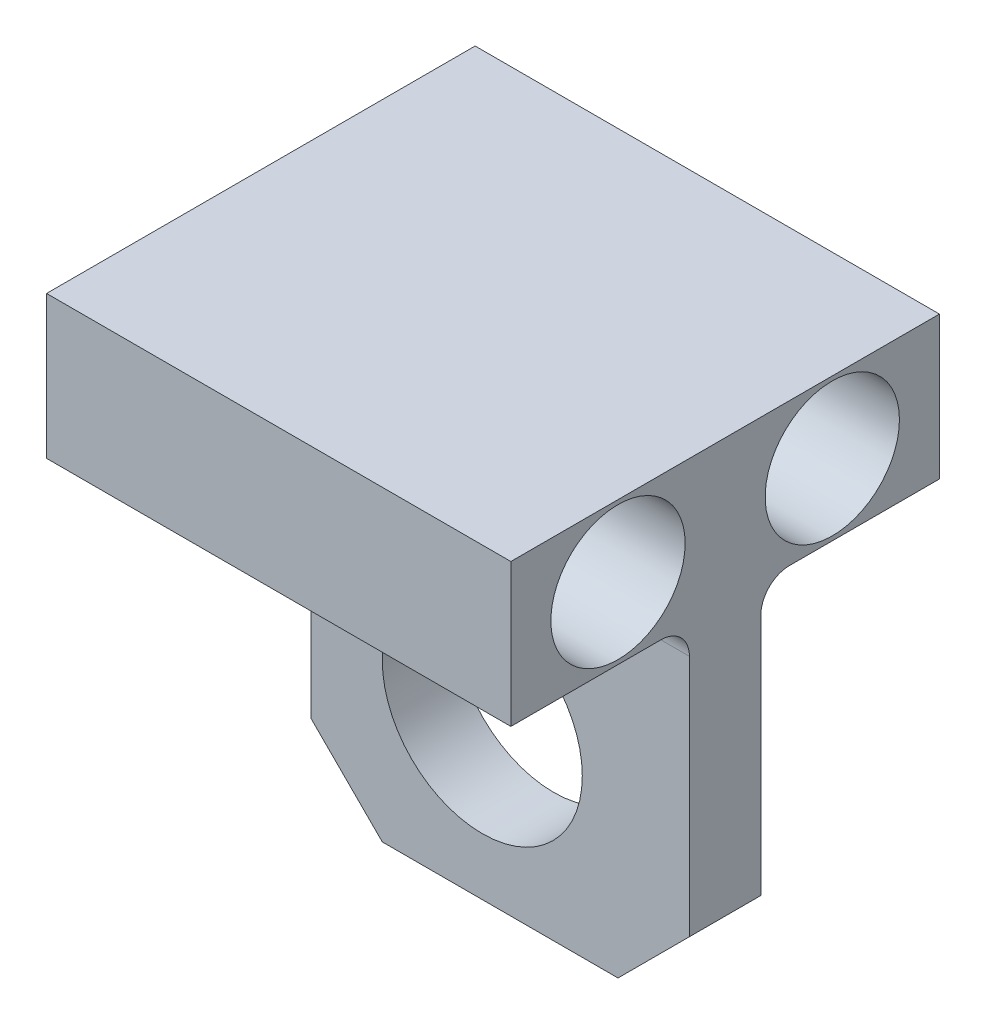
ISO-10303-21;
HEADER;
FILE_DESCRIPTION(('STEP AP214'),'2;1');
FILE_NAME('part.step','',(''),(''),'','','');
FILE_SCHEMA(('AUTOMOTIVE_DESIGN { 1 0 10303 214 1 1 1 1 }'));
ENDSEC;
DATA;
#1=APPLICATION_CONTEXT('core data for automotive mechanical design processes');
#2=APPLICATION_PROTOCOL_DEFINITION('international standard','automotive_design',2000,#1);
#3=PRODUCT_CONTEXT('',#1,'mechanical');
#4=PRODUCT('Part','Part','',(#3));
#5=PRODUCT_RELATED_PRODUCT_CATEGORY('part','',(#4));
#6=PRODUCT_DEFINITION_FORMATION('','',#4);
#7=PRODUCT_DEFINITION_CONTEXT('part definition',#1,'design');
#8=PRODUCT_DEFINITION('design','',#6,#7);
#9=PRODUCT_DEFINITION_SHAPE('','',#8);
#10=(LENGTH_UNIT() NAMED_UNIT(*) SI_UNIT(.MILLI.,.METRE.));
#11=(NAMED_UNIT(*) PLANE_ANGLE_UNIT() SI_UNIT($,.RADIAN.));
#12=(NAMED_UNIT(*) SI_UNIT($,.STERADIAN.) SOLID_ANGLE_UNIT());
#13=UNCERTAINTY_MEASURE_WITH_UNIT(LENGTH_MEASURE(1.E-05),#10,'distance_accuracy_value','');
#14=(GEOMETRIC_REPRESENTATION_CONTEXT(3) GLOBAL_UNCERTAINTY_ASSIGNED_CONTEXT((#13)) GLOBAL_UNIT_ASSIGNED_CONTEXT((#10,
#11,#12)) REPRESENTATION_CONTEXT('',''));
#15=CARTESIAN_POINT('',(0.,0.,0.));
#16=DIRECTION('',(0.,0.,1.));
#17=DIRECTION('',(1.,0.,0.));
#18=AXIS2_PLACEMENT_3D('',#15,#16,#17);
#19=CARTESIAN_POINT('',(16.25,-17.,15.));
#20=DIRECTION('',(0.,1.,0.));
#21=DIRECTION('',(0.,0.,1.));
#22=AXIS2_PLACEMENT_3D('',#19,#20,#21);
#23=PLANE('',#22);
#24=DIRECTION('',(1.,0.,0.));
#25=VECTOR('',#24,1.);
#26=CARTESIAN_POINT('',(-16.25,-17.,2.5));
#27=LINE('',#26,#25);
#28=CARTESIAN_POINT('',(-5.25,-17.,2.5));
#29=VERTEX_POINT('',#28);
#30=CARTESIAN_POINT('',(11.25,-17.,2.5));
#31=VERTEX_POINT('',#30);
#32=EDGE_CURVE('E149',#29,#31,#27,.T.);
#33=ORIENTED_EDGE('',*,*,#32,.F.);
#34=DIRECTION('',(0.,0.,-1.));
#35=VECTOR('',#34,1.);
#36=CARTESIAN_POINT('',(-5.25,-17.,-2.5));
#37=LINE('',#36,#35);
#38=CARTESIAN_POINT('',(-5.25,-17.,-2.5));
#39=VERTEX_POINT('',#38);
#40=EDGE_CURVE('E198',#29,#39,#37,.T.);
#41=ORIENTED_EDGE('',*,*,#40,.T.);
#42=DIRECTION('',(1.,0.,0.));
#43=VECTOR('',#42,1.);
#44=CARTESIAN_POINT('',(-16.25,-17.,-2.5));
#45=LINE('',#44,#43);
#46=CARTESIAN_POINT('',(11.25,-17.,-2.5));
#47=VERTEX_POINT('',#46);
#48=EDGE_CURVE('E222',#39,#47,#45,.T.);
#49=ORIENTED_EDGE('',*,*,#48,.T.);
#50=DIRECTION('',(0.,0.,1.));
#51=VECTOR('',#50,1.);
#52=CARTESIAN_POINT('',(11.25,-17.,15.));
#53=LINE('',#52,#51);
#54=EDGE_CURVE('E196',#47,#31,#53,.T.);
#55=ORIENTED_EDGE('',*,*,#54,.T.);
#56=EDGE_LOOP('',(#33,#41,#49,#55));
#57=FACE_BOUND('',#56,.T.);
#58=ADVANCED_FACE('F35',(#57),#23,.F.);
#59=CARTESIAN_POINT('',(-16.25,0.,0.));
#60=DIRECTION('',(-1.,0.,0.));
#61=DIRECTION('',(0.,0.,1.));
#62=AXIS2_PLACEMENT_3D('',#59,#60,#61);
#63=PLANE('',#62);
#64=CARTESIAN_POINT('',(-16.25,12.,-7.5));
#65=DIRECTION('',(1.,0.,0.));
#66=DIRECTION('',(0.,0.,-1.));
#67=AXIS2_PLACEMENT_3D('',#64,#65,#66);
#68=CIRCLE('',#67,2.74999999999999);
#69=CARTESIAN_POINT('',(-16.25,12.,-10.25));
#70=VERTEX_POINT('',#69);
#71=EDGE_CURVE('E466',#70,#70,#68,.T.);
#72=ORIENTED_EDGE('',*,*,#71,.T.);
#73=EDGE_LOOP('',(#72));
#74=FACE_BOUND('',#73,.T.);
#75=CARTESIAN_POINT('',(-16.25,12.,7.5));
#76=DIRECTION('',(1.,0.,0.));
#77=DIRECTION('',(0.,0.,-1.));
#78=AXIS2_PLACEMENT_3D('',#75,#76,#77);
#79=CIRCLE('',#78,2.74999999999999);
#80=CARTESIAN_POINT('',(-16.25,12.,4.75000000000001));
#81=VERTEX_POINT('',#80);
#82=EDGE_CURVE('E175',#81,#81,#79,.T.);
#83=ORIENTED_EDGE('',*,*,#82,.T.);
#84=EDGE_LOOP('',(#83));
#85=FACE_BOUND('',#84,.T.);
#86=DIRECTION('',(0.,0.,1.));
#87=VECTOR('',#86,1.);
#88=CARTESIAN_POINT('',(-16.25,7.,-15.));
#89=LINE('',#88,#87);
#90=CARTESIAN_POINT('',(-16.25,7.,-15.));
#91=VERTEX_POINT('',#90);
#92=CARTESIAN_POINT('',(-16.25,7.,15.));
#93=VERTEX_POINT('',#92);
#94=EDGE_CURVE('E126',#91,#93,#89,.T.);
#95=ORIENTED_EDGE('',*,*,#94,.T.);
#96=DIRECTION('',(0.,-1.,0.));
#97=VECTOR('',#96,1.);
#98=CARTESIAN_POINT('',(-16.25,-17.,15.));
#99=LINE('',#98,#97);
#100=CARTESIAN_POINT('',(-16.25,17.,15.));
#101=VERTEX_POINT('',#100);
#102=EDGE_CURVE('E131',#101,#93,#99,.T.);
#103=ORIENTED_EDGE('',*,*,#102,.F.);
#104=DIRECTION('',(0.,0.,1.));
#105=VECTOR('',#104,1.);
#106=CARTESIAN_POINT('',(-16.25,17.,15.));
#107=LINE('',#106,#105);
#108=CARTESIAN_POINT('',(-16.25,17.,-15.));
#109=VERTEX_POINT('',#108);
#110=EDGE_CURVE('E156',#109,#101,#107,.T.);
#111=ORIENTED_EDGE('',*,*,#110,.F.);
#112=DIRECTION('',(0.,1.,0.));
#113=VECTOR('',#112,1.);
#114=CARTESIAN_POINT('',(-16.25,-17.,-15.));
#115=LINE('',#114,#113);
#116=EDGE_CURVE('E132',#91,#109,#115,.T.);
#117=ORIENTED_EDGE('',*,*,#116,.F.);
#118=EDGE_LOOP('',(#95,#103,#111,#117));
#119=FACE_BOUND('',#118,.T.);
#120=ADVANCED_FACE('F128',(#74,#85,#119),#63,.T.);
#121=CARTESIAN_POINT('',(-16.25,-17.,-2.5));
#122=DIRECTION('',(0.,0.,1.));
#123=DIRECTION('',(1.,0.,0.));
#124=AXIS2_PLACEMENT_3D('',#121,#122,#123);
#125=PLANE('',#124);
#126=CARTESIAN_POINT('',(1.75,-6.,-2.50000000000001));
#127=DIRECTION('',(0.,0.,1.));
#128=DIRECTION('',(1.,0.,0.));
#129=AXIS2_PLACEMENT_3D('',#126,#127,#128);
#130=CIRCLE('',#129,7.00000000000001);
#131=CARTESIAN_POINT('',(8.75000000000001,-6.,-2.50000000000001));
#132=VERTEX_POINT('',#131);
#133=EDGE_CURVE('E174',#132,#132,#130,.T.);
#134=ORIENTED_EDGE('',*,*,#133,.T.);
#135=EDGE_LOOP('',(#134));
#136=FACE_BOUND('',#135,.T.);
#137=ORIENTED_EDGE('',*,*,#48,.F.);
#138=DIRECTION('',(-0.707106781186546,0.707106781186549,0.));
#139=VECTOR('',#138,1.);
#140=CARTESIAN_POINT('',(-5.25,-17.,-2.50000000000001));
#141=LINE('',#140,#139);
#142=CARTESIAN_POINT('',(-10.25,-12.,-2.5));
#143=VERTEX_POINT('',#142);
#144=EDGE_CURVE('E203',#39,#143,#141,.T.);
#145=ORIENTED_EDGE('',*,*,#144,.T.);
#146=DIRECTION('',(0.,-1.,0.));
#147=VECTOR('',#146,1.);
#148=CARTESIAN_POINT('',(-10.25,-17.,-2.5));
#149=LINE('',#148,#147);
#150=CARTESIAN_POINT('',(-10.25,5.,-2.5));
#151=VERTEX_POINT('',#150);
#152=EDGE_CURVE('E220',#151,#143,#149,.T.);
#153=ORIENTED_EDGE('',*,*,#152,.F.);
#154=DIRECTION('',(1.,0.,0.));
#155=VECTOR('',#154,1.);
#156=CARTESIAN_POINT('',(16.25,5.,-2.5));
#157=LINE('',#156,#155);
#158=CARTESIAN_POINT('',(16.25,5.,-2.5));
#159=VERTEX_POINT('',#158);
#160=EDGE_CURVE('E170',#151,#159,#157,.T.);
#161=ORIENTED_EDGE('',*,*,#160,.T.);
#162=DIRECTION('',(0.,-1.,0.));
#163=VECTOR('',#162,1.);
#164=CARTESIAN_POINT('',(16.25,-17.,-2.5));
#165=LINE('',#164,#163);
#166=CARTESIAN_POINT('',(16.25,-12.,-2.5));
#167=VERTEX_POINT('',#166);
#168=EDGE_CURVE('E136',#159,#167,#165,.T.);
#169=ORIENTED_EDGE('',*,*,#168,.T.);
#170=DIRECTION('',(0.707106781186549,0.707106781186547,0.));
#171=VECTOR('',#170,1.);
#172=CARTESIAN_POINT('',(16.25,-12.,-2.5));
#173=LINE('',#172,#171);
#174=EDGE_CURVE('E201',#167,#47,#173,.F.);
#175=ORIENTED_EDGE('',*,*,#174,.T.);
#176=EDGE_LOOP('',(#137,#145,#153,#161,#169,#175));
#177=FACE_BOUND('',#176,.T.);
#178=ADVANCED_FACE('F219',(#136,#177),#125,.F.);
#179=CARTESIAN_POINT('',(-16.25,-17.,2.5));
#180=DIRECTION('',(0.,0.,-1.));
#181=DIRECTION('',(0.,1.,0.));
#182=AXIS2_PLACEMENT_3D('',#179,#180,#181);
#183=PLANE('',#182);
#184=CARTESIAN_POINT('',(1.75,-6.,2.5));
#185=DIRECTION('',(0.,0.,-1.));
#186=DIRECTION('',(0.,1.,0.));
#187=AXIS2_PLACEMENT_3D('',#184,#185,#186);
#188=CIRCLE('',#187,7.00000000000001);
#189=CARTESIAN_POINT('',(1.75,1.00000000000001,2.5));
#190=VERTEX_POINT('',#189);
#191=EDGE_CURVE('E171',#190,#190,#188,.T.);
#192=ORIENTED_EDGE('',*,*,#191,.T.);
#193=EDGE_LOOP('',(#192));
#194=FACE_BOUND('',#193,.T.);
#195=DIRECTION('',(0.,1.,0.));
#196=VECTOR('',#195,1.);
#197=CARTESIAN_POINT('',(-10.25,-17.,2.5));
#198=LINE('',#197,#196);
#199=CARTESIAN_POINT('',(-10.25,-12.,2.5));
#200=VERTEX_POINT('',#199);
#201=CARTESIAN_POINT('',(-10.25,5.,2.5));
#202=VERTEX_POINT('',#201);
#203=EDGE_CURVE('E168',#200,#202,#198,.T.);
#204=ORIENTED_EDGE('',*,*,#203,.F.);
#205=DIRECTION('',(0.707106781186546,-0.707106781186549,0.));
#206=VECTOR('',#205,1.);
#207=CARTESIAN_POINT('',(-5.25,-17.,2.5));
#208=LINE('',#207,#206);
#209=EDGE_CURVE('E43',#200,#29,#208,.T.);
#210=ORIENTED_EDGE('',*,*,#209,.T.);
#211=ORIENTED_EDGE('',*,*,#32,.T.);
#212=DIRECTION('',(-0.707106781186549,-0.707106781186547,0.));
#213=VECTOR('',#212,1.);
#214=CARTESIAN_POINT('',(16.25,-12.,2.5));
#215=LINE('',#214,#213);
#216=CARTESIAN_POINT('',(16.25,-12.,2.5));
#217=VERTEX_POINT('',#216);
#218=EDGE_CURVE('E50',#31,#217,#215,.F.);
#219=ORIENTED_EDGE('',*,*,#218,.T.);
#220=DIRECTION('',(0.,1.,0.));
#221=VECTOR('',#220,1.);
#222=CARTESIAN_POINT('',(16.25,-17.,2.5));
#223=LINE('',#222,#221);
#224=CARTESIAN_POINT('',(16.25,5.,2.5));
#225=VERTEX_POINT('',#224);
#226=EDGE_CURVE('E225',#217,#225,#223,.T.);
#227=ORIENTED_EDGE('',*,*,#226,.T.);
#228=DIRECTION('',(1.,0.,0.));
#229=VECTOR('',#228,1.);
#230=CARTESIAN_POINT('',(-10.25,5.,2.5));
#231=LINE('',#230,#229);
#232=EDGE_CURVE('E183',#225,#202,#231,.F.);
#233=ORIENTED_EDGE('',*,*,#232,.T.);
#234=EDGE_LOOP('',(#204,#210,#211,#219,#227,#233));
#235=FACE_BOUND('',#234,.T.);
#236=ADVANCED_FACE('F208',(#194,#235),#183,.F.);
#237=CARTESIAN_POINT('',(16.25,-17.,-15.));
#238=DIRECTION('',(0.,0.,1.));
#239=DIRECTION('',(1.,0.,0.));
#240=AXIS2_PLACEMENT_3D('',#237,#238,#239);
#241=PLANE('',#240);
#242=DIRECTION('',(0.,1.,0.));
#243=VECTOR('',#242,1.);
#244=CARTESIAN_POINT('',(16.25,-17.,-15.));
#245=LINE('',#244,#243);
#246=CARTESIAN_POINT('',(16.25,7.,-15.));
#247=VERTEX_POINT('',#246);
#248=CARTESIAN_POINT('',(16.25,17.,-15.));
#249=VERTEX_POINT('',#248);
#250=EDGE_CURVE('E155',#247,#249,#245,.T.);
#251=ORIENTED_EDGE('',*,*,#250,.F.);
#252=DIRECTION('',(1.,0.,0.));
#253=VECTOR('',#252,1.);
#254=CARTESIAN_POINT('',(-16.25,7.,-15.));
#255=LINE('',#254,#253);
#256=EDGE_CURVE('E135',#91,#247,#255,.T.);
#257=ORIENTED_EDGE('',*,*,#256,.F.);
#258=ORIENTED_EDGE('',*,*,#116,.T.);
#259=DIRECTION('',(-1.,0.,0.));
#260=VECTOR('',#259,1.);
#261=CARTESIAN_POINT('',(16.25,17.,-15.));
#262=LINE('',#261,#260);
#263=EDGE_CURVE('E164',#249,#109,#262,.T.);
#264=ORIENTED_EDGE('',*,*,#263,.F.);
#265=EDGE_LOOP('',(#251,#257,#258,#264));
#266=FACE_BOUND('',#265,.T.);
#267=ADVANCED_FACE('F242',(#266),#241,.F.);
#268=CARTESIAN_POINT('',(16.25,17.,15.));
#269=DIRECTION('',(0.,-1.,0.));
#270=DIRECTION('',(0.,0.,-1.));
#271=AXIS2_PLACEMENT_3D('',#268,#269,#270);
#272=PLANE('',#271);
#273=ORIENTED_EDGE('',*,*,#110,.T.);
#274=DIRECTION('',(-1.,0.,0.));
#275=VECTOR('',#274,1.);
#276=CARTESIAN_POINT('',(16.25,17.,15.));
#277=LINE('',#276,#275);
#278=CARTESIAN_POINT('',(16.25,17.,15.));
#279=VERTEX_POINT('',#278);
#280=EDGE_CURVE('E154',#279,#101,#277,.T.);
#281=ORIENTED_EDGE('',*,*,#280,.F.);
#282=DIRECTION('',(0.,0.,1.));
#283=VECTOR('',#282,1.);
#284=CARTESIAN_POINT('',(16.25,17.,15.));
#285=LINE('',#284,#283);
#286=EDGE_CURVE('E158',#249,#279,#285,.T.);
#287=ORIENTED_EDGE('',*,*,#286,.F.);
#288=ORIENTED_EDGE('',*,*,#263,.T.);
#289=EDGE_LOOP('',(#273,#281,#287,#288));
#290=FACE_BOUND('',#289,.T.);
#291=ADVANCED_FACE('F245',(#290),#272,.F.);
#292=CARTESIAN_POINT('',(16.25,-17.,15.));
#293=DIRECTION('',(0.,0.,-1.));
#294=DIRECTION('',(-1.,0.,0.));
#295=AXIS2_PLACEMENT_3D('',#292,#293,#294);
#296=PLANE('',#295);
#297=ORIENTED_EDGE('',*,*,#102,.T.);
#298=DIRECTION('',(1.,0.,0.));
#299=VECTOR('',#298,1.);
#300=CARTESIAN_POINT('',(-16.25,7.,15.));
#301=LINE('',#300,#299);
#302=CARTESIAN_POINT('',(16.25,7.,15.));
#303=VERTEX_POINT('',#302);
#304=EDGE_CURVE('E139',#93,#303,#301,.T.);
#305=ORIENTED_EDGE('',*,*,#304,.T.);
#306=DIRECTION('',(0.,-1.,0.));
#307=VECTOR('',#306,1.);
#308=CARTESIAN_POINT('',(16.25,-17.,15.));
#309=LINE('',#308,#307);
#310=EDGE_CURVE('E165',#279,#303,#309,.T.);
#311=ORIENTED_EDGE('',*,*,#310,.F.);
#312=ORIENTED_EDGE('',*,*,#280,.T.);
#313=EDGE_LOOP('',(#297,#305,#311,#312));
#314=FACE_BOUND('',#313,.T.);
#315=ADVANCED_FACE('F152',(#314),#296,.F.);
#316=CARTESIAN_POINT('',(16.25,0.,0.));
#317=DIRECTION('',(-1.,0.,0.));
#318=DIRECTION('',(0.,0.,1.));
#319=AXIS2_PLACEMENT_3D('',#316,#317,#318);
#320=PLANE('',#319);
#321=CARTESIAN_POINT('',(16.25,12.,-7.5));
#322=DIRECTION('',(1.,0.,0.));
#323=DIRECTION('',(0.,0.,-1.));
#324=AXIS2_PLACEMENT_3D('',#321,#322,#323);
#325=CIRCLE('',#324,4.7);
#326=CARTESIAN_POINT('',(16.25,12.,-12.2));
#327=VERTEX_POINT('',#326);
#328=EDGE_CURVE('E475',#327,#327,#325,.T.);
#329=ORIENTED_EDGE('',*,*,#328,.F.);
#330=EDGE_LOOP('',(#329));
#331=FACE_BOUND('',#330,.T.);
#332=CARTESIAN_POINT('',(16.25,12.,7.5));
#333=DIRECTION('',(1.,0.,0.));
#334=DIRECTION('',(0.,0.,-1.));
#335=AXIS2_PLACEMENT_3D('',#332,#333,#334);
#336=CIRCLE('',#335,4.7);
#337=CARTESIAN_POINT('',(16.25,12.,2.8));
#338=VERTEX_POINT('',#337);
#339=EDGE_CURVE('E463',#338,#338,#336,.T.);
#340=ORIENTED_EDGE('',*,*,#339,.F.);
#341=EDGE_LOOP('',(#340));
#342=FACE_BOUND('',#341,.T.);
#343=ORIENTED_EDGE('',*,*,#226,.F.);
#344=DIRECTION('',(0.,0.,-1.));
#345=VECTOR('',#344,1.);
#346=CARTESIAN_POINT('',(16.25,-12.,0.));
#347=LINE('',#346,#345);
#348=EDGE_CURVE('E11',#217,#167,#347,.T.);
#349=ORIENTED_EDGE('',*,*,#348,.T.);
#350=ORIENTED_EDGE('',*,*,#168,.F.);
#351=CARTESIAN_POINT('',(16.25,5.,-4.5));
#352=DIRECTION('',(-1.,0.,0.));
#353=DIRECTION('',(0.,0.,1.));
#354=AXIS2_PLACEMENT_3D('',#351,#352,#353);
#355=CIRCLE('',#354,2.);
#356=CARTESIAN_POINT('',(16.25,7.,-4.50000000000001));
#357=VERTEX_POINT('',#356);
#358=EDGE_CURVE('E186',#159,#357,#355,.T.);
#359=ORIENTED_EDGE('',*,*,#358,.T.);
#360=DIRECTION('',(0.,0.,1.));
#361=VECTOR('',#360,1.);
#362=CARTESIAN_POINT('',(16.25,7.,-15.));
#363=LINE('',#362,#361);
#364=EDGE_CURVE('E148',#247,#357,#363,.T.);
#365=ORIENTED_EDGE('',*,*,#364,.F.);
#366=ORIENTED_EDGE('',*,*,#250,.T.);
#367=ORIENTED_EDGE('',*,*,#286,.T.);
#368=ORIENTED_EDGE('',*,*,#310,.T.);
#369=DIRECTION('',(0.,0.,1.));
#370=VECTOR('',#369,1.);
#371=CARTESIAN_POINT('',(16.25,7.,15.));
#372=LINE('',#371,#370);
#373=CARTESIAN_POINT('',(16.25,7.,4.5));
#374=VERTEX_POINT('',#373);
#375=EDGE_CURVE('E144',#374,#303,#372,.T.);
#376=ORIENTED_EDGE('',*,*,#375,.F.);
#377=CARTESIAN_POINT('',(16.25,5.,4.5));
#378=DIRECTION('',(-1.,0.,0.));
#379=DIRECTION('',(0.,0.,1.));
#380=AXIS2_PLACEMENT_3D('',#377,#378,#379);
#381=CIRCLE('',#380,2.);
#382=EDGE_CURVE('E190',#374,#225,#381,.T.);
#383=ORIENTED_EDGE('',*,*,#382,.T.);
#384=EDGE_LOOP('',(#343,#349,#350,#359,#365,#366,#367,#368,#376,#383));
#385=FACE_BOUND('',#384,.T.);
#386=ADVANCED_FACE('F247',(#331,#342,#385),#320,.F.);
#387=CARTESIAN_POINT('',(-16.25,7.,-15.));
#388=DIRECTION('',(0.,1.,0.));
#389=DIRECTION('',(0.,0.,1.));
#390=AXIS2_PLACEMENT_3D('',#387,#388,#389);
#391=PLANE('',#390);
#392=ORIENTED_EDGE('',*,*,#364,.T.);
#393=DIRECTION('',(1.,0.,0.));
#394=VECTOR('',#393,1.);
#395=CARTESIAN_POINT('',(-10.25,7.,-4.5));
#396=LINE('',#395,#394);
#397=CARTESIAN_POINT('',(-10.25,7.,-4.5));
#398=VERTEX_POINT('',#397);
#399=EDGE_CURVE('E180',#357,#398,#396,.F.);
#400=ORIENTED_EDGE('',*,*,#399,.T.);
#401=DIRECTION('',(0.,0.,-1.));
#402=VECTOR('',#401,1.);
#403=CARTESIAN_POINT('',(-10.25,7.,15.));
#404=LINE('',#403,#402);
#405=CARTESIAN_POINT('',(-10.25,7.,4.5));
#406=VERTEX_POINT('',#405);
#407=EDGE_CURVE('E226',#406,#398,#404,.T.);
#408=ORIENTED_EDGE('',*,*,#407,.F.);
#409=DIRECTION('',(1.,0.,0.));
#410=VECTOR('',#409,1.);
#411=CARTESIAN_POINT('',(16.25,7.,4.5));
#412=LINE('',#411,#410);
#413=EDGE_CURVE('E178',#406,#374,#412,.T.);
#414=ORIENTED_EDGE('',*,*,#413,.T.);
#415=ORIENTED_EDGE('',*,*,#375,.T.);
#416=ORIENTED_EDGE('',*,*,#304,.F.);
#417=ORIENTED_EDGE('',*,*,#94,.F.);
#418=ORIENTED_EDGE('',*,*,#256,.T.);
#419=EDGE_LOOP('',(#392,#400,#408,#414,#415,#416,#417,#418));
#420=FACE_BOUND('',#419,.T.);
#421=ADVANCED_FACE('F141',(#420),#391,.F.);
#422=CARTESIAN_POINT('',(-10.25,-17.,15.));
#423=DIRECTION('',(-1.,0.,0.));
#424=DIRECTION('',(0.,0.,1.));
#425=AXIS2_PLACEMENT_3D('',#422,#423,#424);
#426=PLANE('',#425);
#427=ORIENTED_EDGE('',*,*,#152,.T.);
#428=DIRECTION('',(0.,0.,1.));
#429=VECTOR('',#428,1.);
#430=CARTESIAN_POINT('',(-10.25,-12.,2.5));
#431=LINE('',#430,#429);
#432=EDGE_CURVE('E58',#143,#200,#431,.T.);
#433=ORIENTED_EDGE('',*,*,#432,.T.);
#434=ORIENTED_EDGE('',*,*,#203,.T.);
#435=CARTESIAN_POINT('',(-10.25,5.,4.5));
#436=DIRECTION('',(-1.,0.,0.));
#437=DIRECTION('',(0.,0.,1.));
#438=AXIS2_PLACEMENT_3D('',#435,#436,#437);
#439=CIRCLE('',#438,2.);
#440=EDGE_CURVE('E193',#202,#406,#439,.F.);
#441=ORIENTED_EDGE('',*,*,#440,.T.);
#442=ORIENTED_EDGE('',*,*,#407,.T.);
#443=CARTESIAN_POINT('',(-10.25,5.,-4.5));
#444=DIRECTION('',(-1.,0.,0.));
#445=DIRECTION('',(0.,0.,1.));
#446=AXIS2_PLACEMENT_3D('',#443,#444,#445);
#447=CIRCLE('',#446,2.);
#448=EDGE_CURVE('E188',#398,#151,#447,.F.);
#449=ORIENTED_EDGE('',*,*,#448,.T.);
#450=EDGE_LOOP('',(#427,#433,#434,#441,#442,#449));
#451=FACE_BOUND('',#450,.T.);
#452=ADVANCED_FACE('F223',(#451),#426,.T.);
#453=CARTESIAN_POINT('',(1.75,-6.,15.));
#454=DIRECTION('',(0.,0.,1.));
#455=DIRECTION('',(1.,0.,0.));
#456=AXIS2_PLACEMENT_3D('',#453,#454,#455);
#457=CYLINDRICAL_SURFACE('',#456,7.00000000000001);
#458=ORIENTED_EDGE('',*,*,#191,.F.);
#459=EDGE_LOOP('',(#458));
#460=FACE_BOUND('',#459,.T.);
#461=ORIENTED_EDGE('',*,*,#133,.F.);
#462=EDGE_LOOP('',(#461));
#463=FACE_BOUND('',#462,.T.);
#464=ADVANCED_FACE('F305',(#460,#463),#457,.F.);
#465=CARTESIAN_POINT('',(16.25,12.,7.5));
#466=DIRECTION('',(1.,0.,0.));
#467=DIRECTION('',(0.,0.,-1.));
#468=AXIS2_PLACEMENT_3D('',#465,#466,#467);
#469=CYLINDRICAL_SURFACE('',#468,2.75);
#470=ORIENTED_EDGE('',*,*,#82,.F.);
#471=EDGE_LOOP('',(#470));
#472=FACE_BOUND('',#471,.T.);
#473=CARTESIAN_POINT('',(9.25,12.,7.5));
#474=DIRECTION('',(1.,0.,0.));
#475=DIRECTION('',(0.,0.,-1.));
#476=AXIS2_PLACEMENT_3D('',#473,#474,#475);
#477=CIRCLE('',#476,2.75);
#478=CARTESIAN_POINT('',(9.25,12.,4.75));
#479=VERTEX_POINT('',#478);
#480=EDGE_CURVE('E457',#479,#479,#477,.T.);
#481=ORIENTED_EDGE('',*,*,#480,.T.);
#482=EDGE_LOOP('',(#481));
#483=FACE_BOUND('',#482,.T.);
#484=ADVANCED_FACE('F407',(#472,#483),#469,.F.);
#485=CARTESIAN_POINT('',(9.25,14.75,7.5));
#486=DIRECTION('',(-1.,0.,0.));
#487=DIRECTION('',(0.,0.,1.));
#488=AXIS2_PLACEMENT_3D('',#485,#486,#487);
#489=PLANE('',#488);
#490=ORIENTED_EDGE('',*,*,#480,.F.);
#491=EDGE_LOOP('',(#490));
#492=FACE_BOUND('',#491,.T.);
#493=CARTESIAN_POINT('',(9.25,12.,7.5));
#494=DIRECTION('',(1.,0.,0.));
#495=DIRECTION('',(0.,0.,-1.));
#496=AXIS2_PLACEMENT_3D('',#493,#494,#495);
#497=CIRCLE('',#496,4.7);
#498=CARTESIAN_POINT('',(9.25,12.,2.8));
#499=VERTEX_POINT('',#498);
#500=EDGE_CURVE('E460',#499,#499,#497,.T.);
#501=ORIENTED_EDGE('',*,*,#500,.T.);
#502=EDGE_LOOP('',(#501));
#503=FACE_BOUND('',#502,.T.);
#504=ADVANCED_FACE('F398',(#492,#503),#489,.F.);
#505=CARTESIAN_POINT('',(16.25,12.,7.5));
#506=DIRECTION('',(1.,0.,0.));
#507=DIRECTION('',(0.,0.,-1.));
#508=AXIS2_PLACEMENT_3D('',#505,#506,#507);
#509=CYLINDRICAL_SURFACE('',#508,4.7);
#510=ORIENTED_EDGE('',*,*,#500,.F.);
#511=EDGE_LOOP('',(#510));
#512=FACE_BOUND('',#511,.T.);
#513=ORIENTED_EDGE('',*,*,#339,.T.);
#514=EDGE_LOOP('',(#513));
#515=FACE_BOUND('',#514,.T.);
#516=ADVANCED_FACE('F389',(#512,#515),#509,.F.);
#517=CARTESIAN_POINT('',(16.25,12.,-7.5));
#518=DIRECTION('',(1.,0.,0.));
#519=DIRECTION('',(0.,0.,-1.));
#520=AXIS2_PLACEMENT_3D('',#517,#518,#519);
#521=CYLINDRICAL_SURFACE('',#520,2.75);
#522=ORIENTED_EDGE('',*,*,#71,.F.);
#523=EDGE_LOOP('',(#522));
#524=FACE_BOUND('',#523,.T.);
#525=CARTESIAN_POINT('',(9.25,12.,-7.5));
#526=DIRECTION('',(1.,0.,0.));
#527=DIRECTION('',(0.,0.,-1.));
#528=AXIS2_PLACEMENT_3D('',#525,#526,#527);
#529=CIRCLE('',#528,2.75);
#530=CARTESIAN_POINT('',(9.25,12.,-10.25));
#531=VERTEX_POINT('',#530);
#532=EDGE_CURVE('E469',#531,#531,#529,.T.);
#533=ORIENTED_EDGE('',*,*,#532,.T.);
#534=EDGE_LOOP('',(#533));
#535=FACE_BOUND('',#534,.T.);
#536=ADVANCED_FACE('F380',(#524,#535),#521,.F.);
#537=CARTESIAN_POINT('',(9.25,14.75,-7.5));
#538=DIRECTION('',(-1.,0.,0.));
#539=DIRECTION('',(0.,0.,1.));
#540=AXIS2_PLACEMENT_3D('',#537,#538,#539);
#541=PLANE('',#540);
#542=ORIENTED_EDGE('',*,*,#532,.F.);
#543=EDGE_LOOP('',(#542));
#544=FACE_BOUND('',#543,.T.);
#545=CARTESIAN_POINT('',(9.25,12.,-7.5));
#546=DIRECTION('',(1.,0.,0.));
#547=DIRECTION('',(0.,0.,-1.));
#548=AXIS2_PLACEMENT_3D('',#545,#546,#547);
#549=CIRCLE('',#548,4.7);
#550=CARTESIAN_POINT('',(9.25,12.,-12.2));
#551=VERTEX_POINT('',#550);
#552=EDGE_CURVE('E472',#551,#551,#549,.T.);
#553=ORIENTED_EDGE('',*,*,#552,.T.);
#554=EDGE_LOOP('',(#553));
#555=FACE_BOUND('',#554,.T.);
#556=ADVANCED_FACE('F373',(#544,#555),#541,.F.);
#557=CARTESIAN_POINT('',(16.25,12.,-7.5));
#558=DIRECTION('',(1.,0.,0.));
#559=DIRECTION('',(0.,0.,-1.));
#560=AXIS2_PLACEMENT_3D('',#557,#558,#559);
#561=CYLINDRICAL_SURFACE('',#560,4.7);
#562=ORIENTED_EDGE('',*,*,#552,.F.);
#563=EDGE_LOOP('',(#562));
#564=FACE_BOUND('',#563,.T.);
#565=ORIENTED_EDGE('',*,*,#328,.T.);
#566=EDGE_LOOP('',(#565));
#567=FACE_BOUND('',#566,.T.);
#568=ADVANCED_FACE('F277',(#564,#567),#561,.F.);
#569=CARTESIAN_POINT('',(-16.25,5.,-4.5));
#570=DIRECTION('',(-1.,0.,0.));
#571=DIRECTION('',(0.,0.,1.));
#572=AXIS2_PLACEMENT_3D('',#569,#570,#571);
#573=CYLINDRICAL_SURFACE('',#572,2.);
#574=ORIENTED_EDGE('',*,*,#448,.F.);
#575=ORIENTED_EDGE('',*,*,#399,.F.);
#576=ORIENTED_EDGE('',*,*,#358,.F.);
#577=ORIENTED_EDGE('',*,*,#160,.F.);
#578=EDGE_LOOP('',(#574,#575,#576,#577));
#579=FACE_BOUND('',#578,.T.);
#580=ADVANCED_FACE('F252',(#579),#573,.F.);
#581=CARTESIAN_POINT('',(-16.25,5.,4.5));
#582=DIRECTION('',(-1.,0.,0.));
#583=DIRECTION('',(0.,0.,1.));
#584=AXIS2_PLACEMENT_3D('',#581,#582,#583);
#585=CYLINDRICAL_SURFACE('',#584,2.);
#586=ORIENTED_EDGE('',*,*,#440,.F.);
#587=ORIENTED_EDGE('',*,*,#232,.F.);
#588=ORIENTED_EDGE('',*,*,#382,.F.);
#589=ORIENTED_EDGE('',*,*,#413,.F.);
#590=EDGE_LOOP('',(#586,#587,#588,#589));
#591=FACE_BOUND('',#590,.T.);
#592=ADVANCED_FACE('F259',(#591),#585,.F.);
#593=CARTESIAN_POINT('',(-5.25,-17.,15.));
#594=DIRECTION('',(-0.707106781186549,-0.707106781186546,0.));
#595=DIRECTION('',(0.,0.,1.));
#596=AXIS2_PLACEMENT_3D('',#593,#594,#595);
#597=PLANE('',#596);
#598=ORIENTED_EDGE('',*,*,#209,.F.);
#599=ORIENTED_EDGE('',*,*,#432,.F.);
#600=ORIENTED_EDGE('',*,*,#144,.F.);
#601=ORIENTED_EDGE('',*,*,#40,.F.);
#602=EDGE_LOOP('',(#598,#599,#600,#601));
#603=FACE_BOUND('',#602,.T.);
#604=ADVANCED_FACE('F216',(#603),#597,.T.);
#605=CARTESIAN_POINT('',(16.25,-12.,0.));
#606=DIRECTION('',(-0.707106781186546,0.707106781186548,0.));
#607=DIRECTION('',(0.,0.,-1.));
#608=AXIS2_PLACEMENT_3D('',#605,#606,#607);
#609=PLANE('',#608);
#610=ORIENTED_EDGE('',*,*,#218,.F.);
#611=ORIENTED_EDGE('',*,*,#54,.F.);
#612=ORIENTED_EDGE('',*,*,#174,.F.);
#613=ORIENTED_EDGE('',*,*,#348,.F.);
#614=EDGE_LOOP('',(#610,#611,#612,#613));
#615=FACE_BOUND('',#614,.T.);
#616=ADVANCED_FACE('F37',(#615),#609,.F.);
#617=CLOSED_SHELL('',(#58,#120,#178,#236,#267,#291,#315,#386,#421,#452,#464,#484,#504,#516,#536,
#556,#568,#580,#592,#604,#616));
#618=MANIFOLD_SOLID_BREP('B2',#617);
#619=ADVANCED_BREP_SHAPE_REPRESENTATION('',(#18,#618),#14);
#620=SHAPE_DEFINITION_REPRESENTATION(#9,#619);
ENDSEC;
END-ISO-10303-21;
